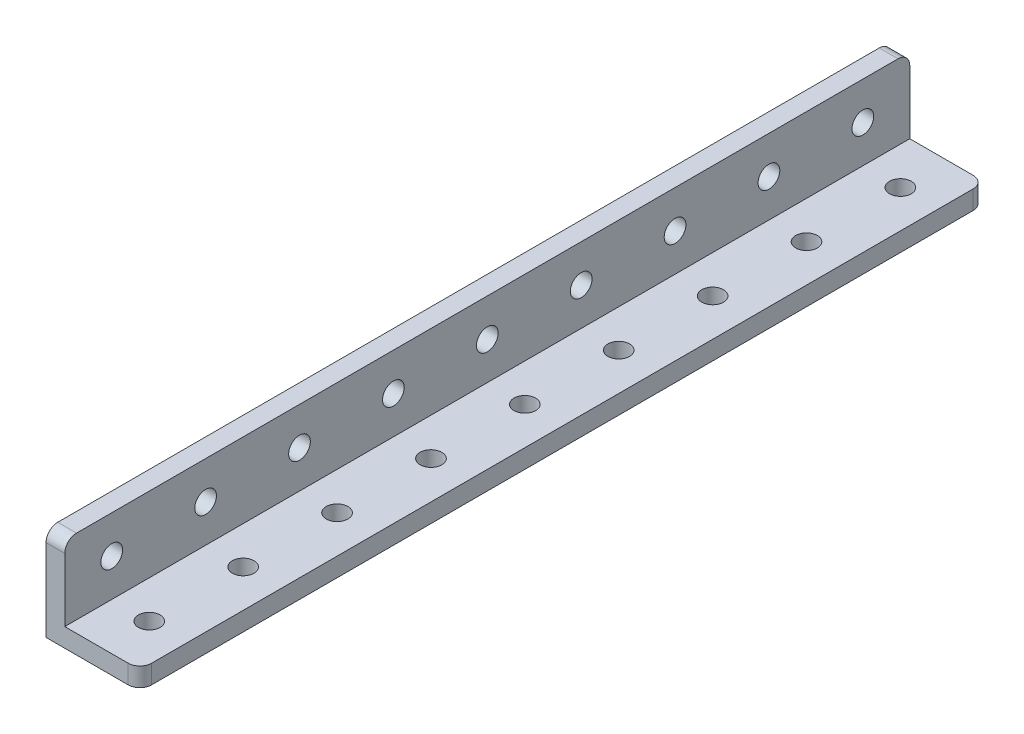
ISO-10303-21;
HEADER;
FILE_DESCRIPTION(('STEP AP214'),'2;1');
FILE_NAME('part.step','',(''),(''),'','','');
FILE_SCHEMA(('AUTOMOTIVE_DESIGN { 1 0 10303 214 1 1 1 1 }'));
ENDSEC;
DATA;
#1=APPLICATION_CONTEXT('core data for automotive mechanical design processes');
#2=APPLICATION_PROTOCOL_DEFINITION('international standard','automotive_design',2000,#1);
#3=PRODUCT_CONTEXT('',#1,'mechanical');
#4=PRODUCT('Part','Part','',(#3));
#5=PRODUCT_RELATED_PRODUCT_CATEGORY('part','',(#4));
#6=PRODUCT_DEFINITION_FORMATION('','',#4);
#7=PRODUCT_DEFINITION_CONTEXT('part definition',#1,'design');
#8=PRODUCT_DEFINITION('design','',#6,#7);
#9=PRODUCT_DEFINITION_SHAPE('','',#8);
#10=(LENGTH_UNIT() NAMED_UNIT(*) SI_UNIT(.MILLI.,.METRE.));
#11=(NAMED_UNIT(*) PLANE_ANGLE_UNIT() SI_UNIT($,.RADIAN.));
#12=(NAMED_UNIT(*) SI_UNIT($,.STERADIAN.) SOLID_ANGLE_UNIT());
#13=UNCERTAINTY_MEASURE_WITH_UNIT(LENGTH_MEASURE(1.E-05),#10,'distance_accuracy_value','');
#14=(GEOMETRIC_REPRESENTATION_CONTEXT(3) GLOBAL_UNCERTAINTY_ASSIGNED_CONTEXT((#13)) GLOBAL_UNIT_ASSIGNED_CONTEXT((#10,
#11,#12)) REPRESENTATION_CONTEXT('',''));
#15=CARTESIAN_POINT('',(0.,0.,0.));
#16=DIRECTION('',(0.,0.,1.));
#17=DIRECTION('',(1.,0.,0.));
#18=AXIS2_PLACEMENT_3D('',#15,#16,#17);
#19=CARTESIAN_POINT('',(0.,16.,-72.));
#20=DIRECTION('',(-1.,0.,0.));
#21=DIRECTION('',(0.,-1.,0.));
#22=AXIS2_PLACEMENT_3D('',#19,#20,#21);
#23=PLANE('',#22);
#24=CARTESIAN_POINT('',(0.,9.6,64.));
#25=DIRECTION('',(-1.,0.,0.));
#26=DIRECTION('',(0.,-1.,0.));
#27=AXIS2_PLACEMENT_3D('',#24,#25,#26);
#28=CIRCLE('',#27,1.85);
#29=CARTESIAN_POINT('',(0.,7.75,64.));
#30=VERTEX_POINT('',#29);
#31=EDGE_CURVE('E231',#30,#30,#28,.T.);
#32=ORIENTED_EDGE('',*,*,#31,.F.);
#33=EDGE_LOOP('',(#32));
#34=FACE_BOUND('',#33,.T.);
#35=CARTESIAN_POINT('',(0.,9.6,48.));
#36=DIRECTION('',(-1.,0.,0.));
#37=DIRECTION('',(0.,-1.,0.));
#38=AXIS2_PLACEMENT_3D('',#35,#36,#37);
#39=CIRCLE('',#38,1.85);
#40=CARTESIAN_POINT('',(0.,7.75,48.));
#41=VERTEX_POINT('',#40);
#42=EDGE_CURVE('E221',#41,#41,#39,.T.);
#43=ORIENTED_EDGE('',*,*,#42,.F.);
#44=EDGE_LOOP('',(#43));
#45=FACE_BOUND('',#44,.T.);
#46=CARTESIAN_POINT('',(0.,9.6,32.));
#47=DIRECTION('',(-1.,0.,0.));
#48=DIRECTION('',(0.,-1.,0.));
#49=AXIS2_PLACEMENT_3D('',#46,#47,#48);
#50=CIRCLE('',#49,1.85);
#51=CARTESIAN_POINT('',(0.,7.75,32.));
#52=VERTEX_POINT('',#51);
#53=EDGE_CURVE('E218',#52,#52,#50,.T.);
#54=ORIENTED_EDGE('',*,*,#53,.F.);
#55=EDGE_LOOP('',(#54));
#56=FACE_BOUND('',#55,.T.);
#57=CARTESIAN_POINT('',(0.,9.6,16.));
#58=DIRECTION('',(-1.,0.,0.));
#59=DIRECTION('',(0.,-1.,0.));
#60=AXIS2_PLACEMENT_3D('',#57,#58,#59);
#61=CIRCLE('',#60,1.85);
#62=CARTESIAN_POINT('',(0.,7.75,16.));
#63=VERTEX_POINT('',#62);
#64=EDGE_CURVE('E215',#63,#63,#61,.T.);
#65=ORIENTED_EDGE('',*,*,#64,.F.);
#66=EDGE_LOOP('',(#65));
#67=FACE_BOUND('',#66,.T.);
#68=CARTESIAN_POINT('',(0.,9.6,-64.));
#69=DIRECTION('',(-1.,0.,0.));
#70=DIRECTION('',(0.,-1.,0.));
#71=AXIS2_PLACEMENT_3D('',#68,#69,#70);
#72=CIRCLE('',#71,1.85);
#73=CARTESIAN_POINT('',(0.,7.75,-64.));
#74=VERTEX_POINT('',#73);
#75=EDGE_CURVE('E211',#74,#74,#72,.T.);
#76=ORIENTED_EDGE('',*,*,#75,.F.);
#77=EDGE_LOOP('',(#76));
#78=FACE_BOUND('',#77,.T.);
#79=CARTESIAN_POINT('',(0.,9.6,-48.));
#80=DIRECTION('',(-1.,0.,0.));
#81=DIRECTION('',(0.,-1.,0.));
#82=AXIS2_PLACEMENT_3D('',#79,#80,#81);
#83=CIRCLE('',#82,1.85);
#84=CARTESIAN_POINT('',(0.,7.75,-48.));
#85=VERTEX_POINT('',#84);
#86=EDGE_CURVE('E207',#85,#85,#83,.T.);
#87=ORIENTED_EDGE('',*,*,#86,.F.);
#88=EDGE_LOOP('',(#87));
#89=FACE_BOUND('',#88,.T.);
#90=CARTESIAN_POINT('',(0.,9.6,-32.));
#91=DIRECTION('',(-1.,0.,0.));
#92=DIRECTION('',(0.,-1.,0.));
#93=AXIS2_PLACEMENT_3D('',#90,#91,#92);
#94=CIRCLE('',#93,1.85);
#95=CARTESIAN_POINT('',(0.,7.75,-32.));
#96=VERTEX_POINT('',#95);
#97=EDGE_CURVE('E203',#96,#96,#94,.T.);
#98=ORIENTED_EDGE('',*,*,#97,.F.);
#99=EDGE_LOOP('',(#98));
#100=FACE_BOUND('',#99,.T.);
#101=CARTESIAN_POINT('',(0.,9.6,-16.));
#102=DIRECTION('',(-1.,0.,0.));
#103=DIRECTION('',(0.,-1.,0.));
#104=AXIS2_PLACEMENT_3D('',#101,#102,#103);
#105=CIRCLE('',#104,1.85);
#106=CARTESIAN_POINT('',(0.,7.75,-16.));
#107=VERTEX_POINT('',#106);
#108=EDGE_CURVE('E199',#107,#107,#105,.T.);
#109=ORIENTED_EDGE('',*,*,#108,.F.);
#110=EDGE_LOOP('',(#109));
#111=FACE_BOUND('',#110,.T.);
#112=CARTESIAN_POINT('',(0.,9.6,0.));
#113=DIRECTION('',(-1.,0.,0.));
#114=DIRECTION('',(0.,-1.,0.));
#115=AXIS2_PLACEMENT_3D('',#112,#113,#114);
#116=CIRCLE('',#115,1.85);
#117=CARTESIAN_POINT('',(0.,7.75,0.));
#118=VERTEX_POINT('',#117);
#119=EDGE_CURVE('E194',#118,#118,#116,.T.);
#120=ORIENTED_EDGE('',*,*,#119,.F.);
#121=EDGE_LOOP('',(#120));
#122=FACE_BOUND('',#121,.T.);
#123=DIRECTION('',(0.,0.,1.));
#124=VECTOR('',#123,1.);
#125=CARTESIAN_POINT('',(0.,16.,-72.));
#126=LINE('',#125,#124);
#127=CARTESIAN_POINT('',(0.,16.,-70.));
#128=VERTEX_POINT('',#127);
#129=CARTESIAN_POINT('',(0.,16.,70.));
#130=VERTEX_POINT('',#129);
#131=EDGE_CURVE('E151',#128,#130,#126,.T.);
#132=ORIENTED_EDGE('',*,*,#131,.F.);
#133=CARTESIAN_POINT('',(0.,14.,-70.));
#134=DIRECTION('',(-1.,0.,0.));
#135=DIRECTION('',(0.,-1.,0.));
#136=AXIS2_PLACEMENT_3D('',#133,#134,#135);
#137=CIRCLE('',#136,2.);
#138=CARTESIAN_POINT('',(0.,14.,-72.));
#139=VERTEX_POINT('',#138);
#140=EDGE_CURVE('E118',#128,#139,#137,.T.);
#141=ORIENTED_EDGE('',*,*,#140,.T.);
#142=DIRECTION('',(0.,-1.,0.));
#143=VECTOR('',#142,1.);
#144=CARTESIAN_POINT('',(0.,16.,-72.));
#145=LINE('',#144,#143);
#146=CARTESIAN_POINT('',(0.,0.,-72.));
#147=VERTEX_POINT('',#146);
#148=EDGE_CURVE('E113',#139,#147,#145,.T.);
#149=ORIENTED_EDGE('',*,*,#148,.T.);
#150=DIRECTION('',(0.,0.,1.));
#151=VECTOR('',#150,1.);
#152=CARTESIAN_POINT('',(0.,0.,-72.));
#153=LINE('',#152,#151);
#154=CARTESIAN_POINT('',(0.,0.,72.));
#155=VERTEX_POINT('',#154);
#156=EDGE_CURVE('E117',#147,#155,#153,.T.);
#157=ORIENTED_EDGE('',*,*,#156,.T.);
#158=DIRECTION('',(0.,-1.,0.));
#159=VECTOR('',#158,1.);
#160=CARTESIAN_POINT('',(0.,16.,72.));
#161=LINE('',#160,#159);
#162=CARTESIAN_POINT('',(0.,14.,72.));
#163=VERTEX_POINT('',#162);
#164=EDGE_CURVE('E143',#163,#155,#161,.T.);
#165=ORIENTED_EDGE('',*,*,#164,.F.);
#166=CARTESIAN_POINT('',(0.,14.,70.));
#167=DIRECTION('',(-1.,0.,0.));
#168=DIRECTION('',(0.,-1.,0.));
#169=AXIS2_PLACEMENT_3D('',#166,#167,#168);
#170=CIRCLE('',#169,2.);
#171=EDGE_CURVE('E169',#163,#130,#170,.T.);
#172=ORIENTED_EDGE('',*,*,#171,.T.);
#173=EDGE_LOOP('',(#132,#141,#149,#157,#165,#172));
#174=FACE_BOUND('',#173,.T.);
#175=ADVANCED_FACE('F32',(#34,#45,#56,#67,#78,#89,#100,#111,#122,#174),#23,.T.);
#176=CARTESIAN_POINT('',(3.2,16.,-72.));
#177=DIRECTION('',(0.,1.,0.));
#178=DIRECTION('',(0.,0.,1.));
#179=AXIS2_PLACEMENT_3D('',#176,#177,#178);
#180=PLANE('',#179);
#181=DIRECTION('',(0.,0.,1.));
#182=VECTOR('',#181,1.);
#183=CARTESIAN_POINT('',(3.2,16.,-72.));
#184=LINE('',#183,#182);
#185=CARTESIAN_POINT('',(3.2,16.,-70.));
#186=VERTEX_POINT('',#185);
#187=CARTESIAN_POINT('',(3.2,16.,70.));
#188=VERTEX_POINT('',#187);
#189=EDGE_CURVE('E155',#186,#188,#184,.T.);
#190=ORIENTED_EDGE('',*,*,#189,.F.);
#191=DIRECTION('',(-1.,0.,0.));
#192=VECTOR('',#191,1.);
#193=CARTESIAN_POINT('',(3.2,16.,-70.));
#194=LINE('',#193,#192);
#195=EDGE_CURVE('E166',#186,#128,#194,.T.);
#196=ORIENTED_EDGE('',*,*,#195,.T.);
#197=ORIENTED_EDGE('',*,*,#131,.T.);
#198=DIRECTION('',(-1.,0.,0.));
#199=VECTOR('',#198,1.);
#200=CARTESIAN_POINT('',(3.2,16.,70.));
#201=LINE('',#200,#199);
#202=EDGE_CURVE('E154',#130,#188,#201,.F.);
#203=ORIENTED_EDGE('',*,*,#202,.T.);
#204=EDGE_LOOP('',(#190,#196,#197,#203));
#205=FACE_BOUND('',#204,.T.);
#206=ADVANCED_FACE('F255',(#205),#180,.T.);
#207=CARTESIAN_POINT('',(3.2,3.2,-72.));
#208=DIRECTION('',(1.,0.,0.));
#209=DIRECTION('',(0.,0.,-1.));
#210=AXIS2_PLACEMENT_3D('',#207,#208,#209);
#211=PLANE('',#210);
#212=CARTESIAN_POINT('',(3.2,9.6,64.));
#213=DIRECTION('',(1.,0.,0.));
#214=DIRECTION('',(0.,0.,-1.));
#215=AXIS2_PLACEMENT_3D('',#212,#213,#214);
#216=CIRCLE('',#215,1.85);
#217=CARTESIAN_POINT('',(3.2,9.6,62.15));
#218=VERTEX_POINT('',#217);
#219=EDGE_CURVE('E36',#218,#218,#216,.T.);
#220=ORIENTED_EDGE('',*,*,#219,.F.);
#221=EDGE_LOOP('',(#220));
#222=FACE_BOUND('',#221,.T.);
#223=CARTESIAN_POINT('',(3.2,9.6,48.));
#224=DIRECTION('',(1.,0.,0.));
#225=DIRECTION('',(0.,0.,-1.));
#226=AXIS2_PLACEMENT_3D('',#223,#224,#225);
#227=CIRCLE('',#226,1.85);
#228=CARTESIAN_POINT('',(3.2,9.6,46.15));
#229=VERTEX_POINT('',#228);
#230=EDGE_CURVE('E219',#229,#229,#227,.T.);
#231=ORIENTED_EDGE('',*,*,#230,.F.);
#232=EDGE_LOOP('',(#231));
#233=FACE_BOUND('',#232,.T.);
#234=CARTESIAN_POINT('',(3.2,9.6,32.));
#235=DIRECTION('',(1.,0.,0.));
#236=DIRECTION('',(0.,0.,-1.));
#237=AXIS2_PLACEMENT_3D('',#234,#235,#236);
#238=CIRCLE('',#237,1.85);
#239=CARTESIAN_POINT('',(3.2,9.6,30.15));
#240=VERTEX_POINT('',#239);
#241=EDGE_CURVE('E216',#240,#240,#238,.T.);
#242=ORIENTED_EDGE('',*,*,#241,.F.);
#243=EDGE_LOOP('',(#242));
#244=FACE_BOUND('',#243,.T.);
#245=CARTESIAN_POINT('',(3.2,9.6,16.));
#246=DIRECTION('',(1.,0.,0.));
#247=DIRECTION('',(0.,0.,-1.));
#248=AXIS2_PLACEMENT_3D('',#245,#246,#247);
#249=CIRCLE('',#248,1.85);
#250=CARTESIAN_POINT('',(3.2,9.6,14.15));
#251=VERTEX_POINT('',#250);
#252=EDGE_CURVE('E212',#251,#251,#249,.T.);
#253=ORIENTED_EDGE('',*,*,#252,.F.);
#254=EDGE_LOOP('',(#253));
#255=FACE_BOUND('',#254,.T.);
#256=CARTESIAN_POINT('',(3.2,9.6,-64.));
#257=DIRECTION('',(1.,0.,0.));
#258=DIRECTION('',(0.,0.,-1.));
#259=AXIS2_PLACEMENT_3D('',#256,#257,#258);
#260=CIRCLE('',#259,1.85);
#261=CARTESIAN_POINT('',(3.2,9.6,-65.85));
#262=VERTEX_POINT('',#261);
#263=EDGE_CURVE('E208',#262,#262,#260,.T.);
#264=ORIENTED_EDGE('',*,*,#263,.F.);
#265=EDGE_LOOP('',(#264));
#266=FACE_BOUND('',#265,.T.);
#267=CARTESIAN_POINT('',(3.2,9.6,-48.));
#268=DIRECTION('',(1.,0.,0.));
#269=DIRECTION('',(0.,0.,-1.));
#270=AXIS2_PLACEMENT_3D('',#267,#268,#269);
#271=CIRCLE('',#270,1.85);
#272=CARTESIAN_POINT('',(3.2,9.6,-49.85));
#273=VERTEX_POINT('',#272);
#274=EDGE_CURVE('E204',#273,#273,#271,.T.);
#275=ORIENTED_EDGE('',*,*,#274,.F.);
#276=EDGE_LOOP('',(#275));
#277=FACE_BOUND('',#276,.T.);
#278=CARTESIAN_POINT('',(3.2,9.6,-32.));
#279=DIRECTION('',(1.,0.,0.));
#280=DIRECTION('',(0.,0.,-1.));
#281=AXIS2_PLACEMENT_3D('',#278,#279,#280);
#282=CIRCLE('',#281,1.85);
#283=CARTESIAN_POINT('',(3.2,9.6,-33.85));
#284=VERTEX_POINT('',#283);
#285=EDGE_CURVE('E200',#284,#284,#282,.T.);
#286=ORIENTED_EDGE('',*,*,#285,.F.);
#287=EDGE_LOOP('',(#286));
#288=FACE_BOUND('',#287,.T.);
#289=CARTESIAN_POINT('',(3.2,9.6,-16.));
#290=DIRECTION('',(1.,0.,0.));
#291=DIRECTION('',(0.,0.,-1.));
#292=AXIS2_PLACEMENT_3D('',#289,#290,#291);
#293=CIRCLE('',#292,1.85);
#294=CARTESIAN_POINT('',(3.2,9.6,-17.85));
#295=VERTEX_POINT('',#294);
#296=EDGE_CURVE('E195',#295,#295,#293,.T.);
#297=ORIENTED_EDGE('',*,*,#296,.F.);
#298=EDGE_LOOP('',(#297));
#299=FACE_BOUND('',#298,.T.);
#300=CARTESIAN_POINT('',(3.2,9.6,0.));
#301=DIRECTION('',(1.,0.,0.));
#302=DIRECTION('',(0.,0.,-1.));
#303=AXIS2_PLACEMENT_3D('',#300,#301,#302);
#304=CIRCLE('',#303,1.85);
#305=CARTESIAN_POINT('',(3.2,9.6,-1.85));
#306=VERTEX_POINT('',#305);
#307=EDGE_CURVE('E145',#306,#306,#304,.T.);
#308=ORIENTED_EDGE('',*,*,#307,.F.);
#309=EDGE_LOOP('',(#308));
#310=FACE_BOUND('',#309,.T.);
#311=DIRECTION('',(0.,1.,0.));
#312=VECTOR('',#311,1.);
#313=CARTESIAN_POINT('',(3.2,3.2,-72.));
#314=LINE('',#313,#312);
#315=CARTESIAN_POINT('',(3.2,3.2,-72.));
#316=VERTEX_POINT('',#315);
#317=CARTESIAN_POINT('',(3.2,14.,-72.));
#318=VERTEX_POINT('',#317);
#319=EDGE_CURVE('E130',#316,#318,#314,.T.);
#320=ORIENTED_EDGE('',*,*,#319,.T.);
#321=CARTESIAN_POINT('',(3.2,14.,-70.));
#322=DIRECTION('',(1.,0.,0.));
#323=DIRECTION('',(0.,0.,-1.));
#324=AXIS2_PLACEMENT_3D('',#321,#322,#323);
#325=CIRCLE('',#324,2.);
#326=EDGE_CURVE('E177',#318,#186,#325,.T.);
#327=ORIENTED_EDGE('',*,*,#326,.T.);
#328=ORIENTED_EDGE('',*,*,#189,.T.);
#329=CARTESIAN_POINT('',(3.2,14.,70.));
#330=DIRECTION('',(1.,0.,0.));
#331=DIRECTION('',(0.,0.,-1.));
#332=AXIS2_PLACEMENT_3D('',#329,#330,#331);
#333=CIRCLE('',#332,2.);
#334=CARTESIAN_POINT('',(3.2,14.,72.));
#335=VERTEX_POINT('',#334);
#336=EDGE_CURVE('E175',#188,#335,#333,.T.);
#337=ORIENTED_EDGE('',*,*,#336,.T.);
#338=DIRECTION('',(0.,1.,0.));
#339=VECTOR('',#338,1.);
#340=CARTESIAN_POINT('',(3.2,3.2,72.));
#341=LINE('',#340,#339);
#342=CARTESIAN_POINT('',(3.2,3.2,72.));
#343=VERTEX_POINT('',#342);
#344=EDGE_CURVE('E123',#343,#335,#341,.T.);
#345=ORIENTED_EDGE('',*,*,#344,.F.);
#346=DIRECTION('',(0.,0.,1.));
#347=VECTOR('',#346,1.);
#348=CARTESIAN_POINT('',(3.2,3.2,-72.));
#349=LINE('',#348,#347);
#350=EDGE_CURVE('E158',#316,#343,#349,.T.);
#351=ORIENTED_EDGE('',*,*,#350,.F.);
#352=EDGE_LOOP('',(#320,#327,#328,#337,#345,#351));
#353=FACE_BOUND('',#352,.T.);
#354=ADVANCED_FACE('F261',(#222,#233,#244,#255,#266,#277,#288,#299,#310,#353),#211,.T.);
#355=CARTESIAN_POINT('',(16.,3.2,-72.));
#356=DIRECTION('',(0.,1.,0.));
#357=DIRECTION('',(-1.,0.,0.));
#358=AXIS2_PLACEMENT_3D('',#355,#356,#357);
#359=PLANE('',#358);
#360=CARTESIAN_POINT('',(9.6,3.2,64.));
#361=DIRECTION('',(0.,1.,0.));
#362=DIRECTION('',(-1.,0.,0.));
#363=AXIS2_PLACEMENT_3D('',#360,#361,#362);
#364=CIRCLE('',#363,1.85);
#365=CARTESIAN_POINT('',(7.75,3.2,64.));
#366=VERTEX_POINT('',#365);
#367=EDGE_CURVE('E392',#366,#366,#364,.T.);
#368=ORIENTED_EDGE('',*,*,#367,.F.);
#369=EDGE_LOOP('',(#368));
#370=FACE_BOUND('',#369,.T.);
#371=CARTESIAN_POINT('',(9.6,3.2,48.));
#372=DIRECTION('',(0.,1.,0.));
#373=DIRECTION('',(-1.,0.,0.));
#374=AXIS2_PLACEMENT_3D('',#371,#372,#373);
#375=CIRCLE('',#374,1.85);
#376=CARTESIAN_POINT('',(7.75,3.2,48.));
#377=VERTEX_POINT('',#376);
#378=EDGE_CURVE('E402',#377,#377,#375,.T.);
#379=ORIENTED_EDGE('',*,*,#378,.F.);
#380=EDGE_LOOP('',(#379));
#381=FACE_BOUND('',#380,.T.);
#382=CARTESIAN_POINT('',(9.6,3.2,32.));
#383=DIRECTION('',(0.,1.,0.));
#384=DIRECTION('',(-1.,0.,0.));
#385=AXIS2_PLACEMENT_3D('',#382,#383,#384);
#386=CIRCLE('',#385,1.85);
#387=CARTESIAN_POINT('',(7.75,3.2,32.));
#388=VERTEX_POINT('',#387);
#389=EDGE_CURVE('E408',#388,#388,#386,.T.);
#390=ORIENTED_EDGE('',*,*,#389,.F.);
#391=EDGE_LOOP('',(#390));
#392=FACE_BOUND('',#391,.T.);
#393=CARTESIAN_POINT('',(9.6,3.2,16.));
#394=DIRECTION('',(0.,1.,0.));
#395=DIRECTION('',(-1.,0.,0.));
#396=AXIS2_PLACEMENT_3D('',#393,#394,#395);
#397=CIRCLE('',#396,1.85);
#398=CARTESIAN_POINT('',(7.75,3.2,16.));
#399=VERTEX_POINT('',#398);
#400=EDGE_CURVE('E414',#399,#399,#397,.T.);
#401=ORIENTED_EDGE('',*,*,#400,.F.);
#402=EDGE_LOOP('',(#401));
#403=FACE_BOUND('',#402,.T.);
#404=CARTESIAN_POINT('',(9.6,3.2,-64.));
#405=DIRECTION('',(0.,1.,0.));
#406=DIRECTION('',(-1.,0.,0.));
#407=AXIS2_PLACEMENT_3D('',#404,#405,#406);
#408=CIRCLE('',#407,1.85);
#409=CARTESIAN_POINT('',(7.75,3.2,-64.));
#410=VERTEX_POINT('',#409);
#411=EDGE_CURVE('E420',#410,#410,#408,.T.);
#412=ORIENTED_EDGE('',*,*,#411,.F.);
#413=EDGE_LOOP('',(#412));
#414=FACE_BOUND('',#413,.T.);
#415=CARTESIAN_POINT('',(9.6,3.2,-48.));
#416=DIRECTION('',(0.,1.,0.));
#417=DIRECTION('',(-1.,0.,0.));
#418=AXIS2_PLACEMENT_3D('',#415,#416,#417);
#419=CIRCLE('',#418,1.85);
#420=CARTESIAN_POINT('',(7.75,3.2,-48.));
#421=VERTEX_POINT('',#420);
#422=EDGE_CURVE('E426',#421,#421,#419,.T.);
#423=ORIENTED_EDGE('',*,*,#422,.F.);
#424=EDGE_LOOP('',(#423));
#425=FACE_BOUND('',#424,.T.);
#426=CARTESIAN_POINT('',(9.6,3.2,-32.));
#427=DIRECTION('',(0.,1.,0.));
#428=DIRECTION('',(-1.,0.,0.));
#429=AXIS2_PLACEMENT_3D('',#426,#427,#428);
#430=CIRCLE('',#429,1.85);
#431=CARTESIAN_POINT('',(7.75,3.2,-32.));
#432=VERTEX_POINT('',#431);
#433=EDGE_CURVE('E432',#432,#432,#430,.T.);
#434=ORIENTED_EDGE('',*,*,#433,.F.);
#435=EDGE_LOOP('',(#434));
#436=FACE_BOUND('',#435,.T.);
#437=CARTESIAN_POINT('',(9.6,3.2,-16.));
#438=DIRECTION('',(0.,1.,0.));
#439=DIRECTION('',(-1.,0.,0.));
#440=AXIS2_PLACEMENT_3D('',#437,#438,#439);
#441=CIRCLE('',#440,1.85);
#442=CARTESIAN_POINT('',(7.75,3.2,-16.));
#443=VERTEX_POINT('',#442);
#444=EDGE_CURVE('E437',#443,#443,#441,.T.);
#445=ORIENTED_EDGE('',*,*,#444,.F.);
#446=EDGE_LOOP('',(#445));
#447=FACE_BOUND('',#446,.T.);
#448=CARTESIAN_POINT('',(9.6,3.2,0.));
#449=DIRECTION('',(0.,1.,0.));
#450=DIRECTION('',(-1.,0.,0.));
#451=AXIS2_PLACEMENT_3D('',#448,#449,#450);
#452=CIRCLE('',#451,1.85);
#453=CARTESIAN_POINT('',(7.75,3.2,0.));
#454=VERTEX_POINT('',#453);
#455=EDGE_CURVE('E247',#454,#454,#452,.T.);
#456=ORIENTED_EDGE('',*,*,#455,.F.);
#457=EDGE_LOOP('',(#456));
#458=FACE_BOUND('',#457,.T.);
#459=DIRECTION('',(0.,0.,1.));
#460=VECTOR('',#459,1.);
#461=CARTESIAN_POINT('',(16.,3.2,-72.));
#462=LINE('',#461,#460);
#463=CARTESIAN_POINT('',(16.,3.2,-70.));
#464=VERTEX_POINT('',#463);
#465=CARTESIAN_POINT('',(16.,3.2,70.));
#466=VERTEX_POINT('',#465);
#467=EDGE_CURVE('E161',#464,#466,#462,.T.);
#468=ORIENTED_EDGE('',*,*,#467,.F.);
#469=CARTESIAN_POINT('',(14.,3.2,-70.));
#470=DIRECTION('',(0.,1.,0.));
#471=DIRECTION('',(-1.,0.,0.));
#472=AXIS2_PLACEMENT_3D('',#469,#470,#471);
#473=CIRCLE('',#472,2.);
#474=CARTESIAN_POINT('',(14.,3.2,-72.));
#475=VERTEX_POINT('',#474);
#476=EDGE_CURVE('E185',#464,#475,#473,.T.);
#477=ORIENTED_EDGE('',*,*,#476,.T.);
#478=DIRECTION('',(-1.,0.,0.));
#479=VECTOR('',#478,1.);
#480=CARTESIAN_POINT('',(16.,3.2,-72.));
#481=LINE('',#480,#479);
#482=EDGE_CURVE('E136',#475,#316,#481,.T.);
#483=ORIENTED_EDGE('',*,*,#482,.T.);
#484=ORIENTED_EDGE('',*,*,#350,.T.);
#485=DIRECTION('',(-1.,0.,0.));
#486=VECTOR('',#485,1.);
#487=CARTESIAN_POINT('',(16.,3.2,72.));
#488=LINE('',#487,#486);
#489=CARTESIAN_POINT('',(14.,3.2,72.));
#490=VERTEX_POINT('',#489);
#491=EDGE_CURVE('E147',#490,#343,#488,.T.);
#492=ORIENTED_EDGE('',*,*,#491,.F.);
#493=CARTESIAN_POINT('',(14.,3.2,70.));
#494=DIRECTION('',(0.,1.,0.));
#495=DIRECTION('',(-1.,0.,0.));
#496=AXIS2_PLACEMENT_3D('',#493,#494,#495);
#497=CIRCLE('',#496,2.);
#498=EDGE_CURVE('E57',#490,#466,#497,.T.);
#499=ORIENTED_EDGE('',*,*,#498,.T.);
#500=EDGE_LOOP('',(#468,#477,#483,#484,#492,#499));
#501=FACE_BOUND('',#500,.T.);
#502=ADVANCED_FACE('F287',(#370,#381,#392,#403,#414,#425,#436,#447,#458,#501),#359,.T.);
#503=CARTESIAN_POINT('',(16.,0.,-72.));
#504=DIRECTION('',(1.,0.,0.));
#505=DIRECTION('',(0.,0.,-1.));
#506=AXIS2_PLACEMENT_3D('',#503,#504,#505);
#507=PLANE('',#506);
#508=DIRECTION('',(0.,0.,1.));
#509=VECTOR('',#508,1.);
#510=CARTESIAN_POINT('',(16.,0.,-72.));
#511=LINE('',#510,#509);
#512=CARTESIAN_POINT('',(16.,0.,-70.));
#513=VERTEX_POINT('',#512);
#514=CARTESIAN_POINT('',(16.,0.,70.));
#515=VERTEX_POINT('',#514);
#516=EDGE_CURVE('E129',#513,#515,#511,.T.);
#517=ORIENTED_EDGE('',*,*,#516,.F.);
#518=DIRECTION('',(0.,1.,0.));
#519=VECTOR('',#518,1.);
#520=CARTESIAN_POINT('',(16.,0.,-70.));
#521=LINE('',#520,#519);
#522=EDGE_CURVE('E181',#513,#464,#521,.T.);
#523=ORIENTED_EDGE('',*,*,#522,.T.);
#524=ORIENTED_EDGE('',*,*,#467,.T.);
#525=DIRECTION('',(0.,1.,0.));
#526=VECTOR('',#525,1.);
#527=CARTESIAN_POINT('',(16.,0.,70.));
#528=LINE('',#527,#526);
#529=EDGE_CURVE('E179',#466,#515,#528,.F.);
#530=ORIENTED_EDGE('',*,*,#529,.T.);
#531=EDGE_LOOP('',(#517,#523,#524,#530));
#532=FACE_BOUND('',#531,.T.);
#533=ADVANCED_FACE('F301',(#532),#507,.T.);
#534=CARTESIAN_POINT('',(0.,0.,-72.));
#535=DIRECTION('',(0.,-1.,0.));
#536=DIRECTION('',(0.,0.,-1.));
#537=AXIS2_PLACEMENT_3D('',#534,#535,#536);
#538=PLANE('',#537);
#539=CARTESIAN_POINT('',(9.6,0.,64.));
#540=DIRECTION('',(0.,-1.,0.));
#541=DIRECTION('',(0.,0.,-1.));
#542=AXIS2_PLACEMENT_3D('',#539,#540,#541);
#543=CIRCLE('',#542,1.85);
#544=CARTESIAN_POINT('',(9.6,0.,62.15));
#545=VERTEX_POINT('',#544);
#546=EDGE_CURVE('E395',#545,#545,#543,.T.);
#547=ORIENTED_EDGE('',*,*,#546,.F.);
#548=EDGE_LOOP('',(#547));
#549=FACE_BOUND('',#548,.T.);
#550=CARTESIAN_POINT('',(9.6,0.,48.));
#551=DIRECTION('',(0.,-1.,0.));
#552=DIRECTION('',(0.,0.,-1.));
#553=AXIS2_PLACEMENT_3D('',#550,#551,#552);
#554=CIRCLE('',#553,1.85);
#555=CARTESIAN_POINT('',(9.6,0.,46.15));
#556=VERTEX_POINT('',#555);
#557=EDGE_CURVE('E397',#556,#556,#554,.T.);
#558=ORIENTED_EDGE('',*,*,#557,.F.);
#559=EDGE_LOOP('',(#558));
#560=FACE_BOUND('',#559,.T.);
#561=CARTESIAN_POINT('',(9.6,0.,32.));
#562=DIRECTION('',(0.,-1.,0.));
#563=DIRECTION('',(0.,0.,-1.));
#564=AXIS2_PLACEMENT_3D('',#561,#562,#563);
#565=CIRCLE('',#564,1.85);
#566=CARTESIAN_POINT('',(9.6,0.,30.15));
#567=VERTEX_POINT('',#566);
#568=EDGE_CURVE('E405',#567,#567,#565,.T.);
#569=ORIENTED_EDGE('',*,*,#568,.F.);
#570=EDGE_LOOP('',(#569));
#571=FACE_BOUND('',#570,.T.);
#572=CARTESIAN_POINT('',(9.6,0.,16.));
#573=DIRECTION('',(0.,-1.,0.));
#574=DIRECTION('',(0.,0.,-1.));
#575=AXIS2_PLACEMENT_3D('',#572,#573,#574);
#576=CIRCLE('',#575,1.85);
#577=CARTESIAN_POINT('',(9.6,0.,14.15));
#578=VERTEX_POINT('',#577);
#579=EDGE_CURVE('E411',#578,#578,#576,.T.);
#580=ORIENTED_EDGE('',*,*,#579,.F.);
#581=EDGE_LOOP('',(#580));
#582=FACE_BOUND('',#581,.T.);
#583=CARTESIAN_POINT('',(9.6,0.,-64.));
#584=DIRECTION('',(0.,-1.,0.));
#585=DIRECTION('',(0.,0.,-1.));
#586=AXIS2_PLACEMENT_3D('',#583,#584,#585);
#587=CIRCLE('',#586,1.85);
#588=CARTESIAN_POINT('',(9.6,0.,-65.85));
#589=VERTEX_POINT('',#588);
#590=EDGE_CURVE('E417',#589,#589,#587,.T.);
#591=ORIENTED_EDGE('',*,*,#590,.F.);
#592=EDGE_LOOP('',(#591));
#593=FACE_BOUND('',#592,.T.);
#594=CARTESIAN_POINT('',(9.6,0.,-48.));
#595=DIRECTION('',(0.,-1.,0.));
#596=DIRECTION('',(0.,0.,-1.));
#597=AXIS2_PLACEMENT_3D('',#594,#595,#596);
#598=CIRCLE('',#597,1.85);
#599=CARTESIAN_POINT('',(9.6,0.,-49.85));
#600=VERTEX_POINT('',#599);
#601=EDGE_CURVE('E423',#600,#600,#598,.T.);
#602=ORIENTED_EDGE('',*,*,#601,.F.);
#603=EDGE_LOOP('',(#602));
#604=FACE_BOUND('',#603,.T.);
#605=CARTESIAN_POINT('',(9.6,0.,-32.));
#606=DIRECTION('',(0.,-1.,0.));
#607=DIRECTION('',(0.,0.,-1.));
#608=AXIS2_PLACEMENT_3D('',#605,#606,#607);
#609=CIRCLE('',#608,1.85);
#610=CARTESIAN_POINT('',(9.6,0.,-33.85));
#611=VERTEX_POINT('',#610);
#612=EDGE_CURVE('E429',#611,#611,#609,.T.);
#613=ORIENTED_EDGE('',*,*,#612,.F.);
#614=EDGE_LOOP('',(#613));
#615=FACE_BOUND('',#614,.T.);
#616=CARTESIAN_POINT('',(9.6,0.,-16.));
#617=DIRECTION('',(0.,-1.,0.));
#618=DIRECTION('',(0.,0.,-1.));
#619=AXIS2_PLACEMENT_3D('',#616,#617,#618);
#620=CIRCLE('',#619,1.85);
#621=CARTESIAN_POINT('',(9.6,0.,-17.85));
#622=VERTEX_POINT('',#621);
#623=EDGE_CURVE('E435',#622,#622,#620,.T.);
#624=ORIENTED_EDGE('',*,*,#623,.F.);
#625=EDGE_LOOP('',(#624));
#626=FACE_BOUND('',#625,.T.);
#627=CARTESIAN_POINT('',(9.6,0.,0.));
#628=DIRECTION('',(0.,-1.,0.));
#629=DIRECTION('',(0.,0.,-1.));
#630=AXIS2_PLACEMENT_3D('',#627,#628,#629);
#631=CIRCLE('',#630,1.85);
#632=CARTESIAN_POINT('',(9.6,0.,-1.85));
#633=VERTEX_POINT('',#632);
#634=EDGE_CURVE('E198',#633,#633,#631,.T.);
#635=ORIENTED_EDGE('',*,*,#634,.F.);
#636=EDGE_LOOP('',(#635));
#637=FACE_BOUND('',#636,.T.);
#638=DIRECTION('',(1.,0.,0.));
#639=VECTOR('',#638,1.);
#640=CARTESIAN_POINT('',(0.,0.,-72.));
#641=LINE('',#640,#639);
#642=CARTESIAN_POINT('',(14.,0.,-72.));
#643=VERTEX_POINT('',#642);
#644=EDGE_CURVE('E122',#147,#643,#641,.T.);
#645=ORIENTED_EDGE('',*,*,#644,.T.);
#646=CARTESIAN_POINT('',(14.,0.,-70.));
#647=DIRECTION('',(0.,-1.,0.));
#648=DIRECTION('',(0.,0.,-1.));
#649=AXIS2_PLACEMENT_3D('',#646,#647,#648);
#650=CIRCLE('',#649,2.);
#651=EDGE_CURVE('E188',#643,#513,#650,.T.);
#652=ORIENTED_EDGE('',*,*,#651,.T.);
#653=ORIENTED_EDGE('',*,*,#516,.T.);
#654=CARTESIAN_POINT('',(14.,0.,70.));
#655=DIRECTION('',(0.,-1.,0.));
#656=DIRECTION('',(0.,0.,-1.));
#657=AXIS2_PLACEMENT_3D('',#654,#655,#656);
#658=CIRCLE('',#657,2.);
#659=CARTESIAN_POINT('',(14.,0.,72.));
#660=VERTEX_POINT('',#659);
#661=EDGE_CURVE('E49',#515,#660,#658,.T.);
#662=ORIENTED_EDGE('',*,*,#661,.T.);
#663=DIRECTION('',(1.,0.,0.));
#664=VECTOR('',#663,1.);
#665=CARTESIAN_POINT('',(0.,0.,72.));
#666=LINE('',#665,#664);
#667=EDGE_CURVE('E128',#155,#660,#666,.T.);
#668=ORIENTED_EDGE('',*,*,#667,.F.);
#669=ORIENTED_EDGE('',*,*,#156,.F.);
#670=EDGE_LOOP('',(#645,#652,#653,#662,#668,#669));
#671=FACE_BOUND('',#670,.T.);
#672=ADVANCED_FACE('F126',(#549,#560,#571,#582,#593,#604,#615,#626,#637,#671),#538,.T.);
#673=CARTESIAN_POINT('',(0.,16.,-72.));
#674=DIRECTION('',(0.,0.,-1.));
#675=DIRECTION('',(-1.,0.,0.));
#676=AXIS2_PLACEMENT_3D('',#673,#674,#675);
#677=PLANE('',#676);
#678=ORIENTED_EDGE('',*,*,#148,.F.);
#679=DIRECTION('',(-1.,0.,0.));
#680=VECTOR('',#679,1.);
#681=CARTESIAN_POINT('',(0.,14.,-72.));
#682=LINE('',#681,#680);
#683=EDGE_CURVE('E173',#139,#318,#682,.F.);
#684=ORIENTED_EDGE('',*,*,#683,.T.);
#685=ORIENTED_EDGE('',*,*,#319,.F.);
#686=ORIENTED_EDGE('',*,*,#482,.F.);
#687=DIRECTION('',(0.,1.,0.));
#688=VECTOR('',#687,1.);
#689=CARTESIAN_POINT('',(14.,16.,-72.));
#690=LINE('',#689,#688);
#691=EDGE_CURVE('E135',#475,#643,#690,.F.);
#692=ORIENTED_EDGE('',*,*,#691,.T.);
#693=ORIENTED_EDGE('',*,*,#644,.F.);
#694=EDGE_LOOP('',(#678,#684,#685,#686,#692,#693));
#695=FACE_BOUND('',#694,.T.);
#696=ADVANCED_FACE('F132',(#695),#677,.T.);
#697=CARTESIAN_POINT('',(0.,16.,72.));
#698=DIRECTION('',(0.,0.,-1.));
#699=DIRECTION('',(-1.,0.,0.));
#700=AXIS2_PLACEMENT_3D('',#697,#698,#699);
#701=PLANE('',#700);
#702=ORIENTED_EDGE('',*,*,#667,.T.);
#703=DIRECTION('',(0.,1.,0.));
#704=VECTOR('',#703,1.);
#705=CARTESIAN_POINT('',(14.,3.2,72.));
#706=LINE('',#705,#704);
#707=EDGE_CURVE('E11',#660,#490,#706,.T.);
#708=ORIENTED_EDGE('',*,*,#707,.T.);
#709=ORIENTED_EDGE('',*,*,#491,.T.);
#710=ORIENTED_EDGE('',*,*,#344,.T.);
#711=DIRECTION('',(-1.,0.,0.));
#712=VECTOR('',#711,1.);
#713=CARTESIAN_POINT('',(0.,14.,72.));
#714=LINE('',#713,#712);
#715=EDGE_CURVE('E41',#335,#163,#714,.T.);
#716=ORIENTED_EDGE('',*,*,#715,.T.);
#717=ORIENTED_EDGE('',*,*,#164,.T.);
#718=EDGE_LOOP('',(#702,#708,#709,#710,#716,#717));
#719=FACE_BOUND('',#718,.T.);
#720=ADVANCED_FACE('F273',(#719),#701,.F.);
#721=CARTESIAN_POINT('',(3.2,14.,-70.));
#722=DIRECTION('',(-1.,0.,0.));
#723=DIRECTION('',(0.,0.,1.));
#724=AXIS2_PLACEMENT_3D('',#721,#722,#723);
#725=CYLINDRICAL_SURFACE('',#724,2.);
#726=ORIENTED_EDGE('',*,*,#326,.F.);
#727=ORIENTED_EDGE('',*,*,#683,.F.);
#728=ORIENTED_EDGE('',*,*,#140,.F.);
#729=ORIENTED_EDGE('',*,*,#195,.F.);
#730=EDGE_LOOP('',(#726,#727,#728,#729));
#731=FACE_BOUND('',#730,.T.);
#732=ADVANCED_FACE('F269',(#731),#725,.T.);
#733=CARTESIAN_POINT('',(14.,0.,-70.));
#734=DIRECTION('',(0.,1.,0.));
#735=DIRECTION('',(0.,0.,1.));
#736=AXIS2_PLACEMENT_3D('',#733,#734,#735);
#737=CYLINDRICAL_SURFACE('',#736,2.);
#738=ORIENTED_EDGE('',*,*,#651,.F.);
#739=ORIENTED_EDGE('',*,*,#691,.F.);
#740=ORIENTED_EDGE('',*,*,#476,.F.);
#741=ORIENTED_EDGE('',*,*,#522,.F.);
#742=EDGE_LOOP('',(#738,#739,#740,#741));
#743=FACE_BOUND('',#742,.T.);
#744=ADVANCED_FACE('F272',(#743),#737,.T.);
#745=CARTESIAN_POINT('',(14.,16.,70.));
#746=DIRECTION('',(0.,-1.,0.));
#747=DIRECTION('',(0.,0.,-1.));
#748=AXIS2_PLACEMENT_3D('',#745,#746,#747);
#749=CYLINDRICAL_SURFACE('',#748,2.);
#750=ORIENTED_EDGE('',*,*,#661,.F.);
#751=ORIENTED_EDGE('',*,*,#529,.F.);
#752=ORIENTED_EDGE('',*,*,#498,.F.);
#753=ORIENTED_EDGE('',*,*,#707,.F.);
#754=EDGE_LOOP('',(#750,#751,#752,#753));
#755=FACE_BOUND('',#754,.T.);
#756=ADVANCED_FACE('F276',(#755),#749,.T.);
#757=CARTESIAN_POINT('',(0.,14.,70.));
#758=DIRECTION('',(1.,0.,0.));
#759=DIRECTION('',(0.,0.,-1.));
#760=AXIS2_PLACEMENT_3D('',#757,#758,#759);
#761=CYLINDRICAL_SURFACE('',#760,2.);
#762=ORIENTED_EDGE('',*,*,#336,.F.);
#763=ORIENTED_EDGE('',*,*,#202,.F.);
#764=ORIENTED_EDGE('',*,*,#171,.F.);
#765=ORIENTED_EDGE('',*,*,#715,.F.);
#766=EDGE_LOOP('',(#762,#763,#764,#765));
#767=FACE_BOUND('',#766,.T.);
#768=ADVANCED_FACE('F34',(#767),#761,.T.);
#769=CARTESIAN_POINT('',(16.,9.6,0.));
#770=DIRECTION('',(-1.,0.,0.));
#771=DIRECTION('',(0.,-1.,0.));
#772=AXIS2_PLACEMENT_3D('',#769,#770,#771);
#773=CYLINDRICAL_SURFACE('',#772,1.85);
#774=ORIENTED_EDGE('',*,*,#307,.T.);
#775=EDGE_LOOP('',(#774));
#776=FACE_BOUND('',#775,.T.);
#777=ORIENTED_EDGE('',*,*,#119,.T.);
#778=EDGE_LOOP('',(#777));
#779=FACE_BOUND('',#778,.T.);
#780=ADVANCED_FACE('F252',(#776,#779),#773,.F.);
#781=CARTESIAN_POINT('',(9.6,16.,0.));
#782=DIRECTION('',(0.,-1.,0.));
#783=DIRECTION('',(0.,0.,-1.));
#784=AXIS2_PLACEMENT_3D('',#781,#782,#783);
#785=CYLINDRICAL_SURFACE('',#784,1.85);
#786=ORIENTED_EDGE('',*,*,#455,.T.);
#787=EDGE_LOOP('',(#786));
#788=FACE_BOUND('',#787,.T.);
#789=ORIENTED_EDGE('',*,*,#634,.T.);
#790=EDGE_LOOP('',(#789));
#791=FACE_BOUND('',#790,.T.);
#792=ADVANCED_FACE('F320',(#788,#791),#785,.F.);
#793=CARTESIAN_POINT('',(16.,9.6,-16.));
#794=DIRECTION('',(-1.,0.,0.));
#795=DIRECTION('',(0.,-1.,0.));
#796=AXIS2_PLACEMENT_3D('',#793,#794,#795);
#797=CYLINDRICAL_SURFACE('',#796,1.85);
#798=ORIENTED_EDGE('',*,*,#296,.T.);
#799=EDGE_LOOP('',(#798));
#800=FACE_BOUND('',#799,.T.);
#801=ORIENTED_EDGE('',*,*,#108,.T.);
#802=EDGE_LOOP('',(#801));
#803=FACE_BOUND('',#802,.T.);
#804=ADVANCED_FACE('F324',(#800,#803),#797,.F.);
#805=CARTESIAN_POINT('',(16.,9.6,-32.));
#806=DIRECTION('',(-1.,0.,0.));
#807=DIRECTION('',(0.,-1.,0.));
#808=AXIS2_PLACEMENT_3D('',#805,#806,#807);
#809=CYLINDRICAL_SURFACE('',#808,1.85);
#810=ORIENTED_EDGE('',*,*,#285,.T.);
#811=EDGE_LOOP('',(#810));
#812=FACE_BOUND('',#811,.T.);
#813=ORIENTED_EDGE('',*,*,#97,.T.);
#814=EDGE_LOOP('',(#813));
#815=FACE_BOUND('',#814,.T.);
#816=ADVANCED_FACE('F328',(#812,#815),#809,.F.);
#817=CARTESIAN_POINT('',(16.,9.6,-48.));
#818=DIRECTION('',(-1.,0.,0.));
#819=DIRECTION('',(0.,-1.,0.));
#820=AXIS2_PLACEMENT_3D('',#817,#818,#819);
#821=CYLINDRICAL_SURFACE('',#820,1.85);
#822=ORIENTED_EDGE('',*,*,#274,.T.);
#823=EDGE_LOOP('',(#822));
#824=FACE_BOUND('',#823,.T.);
#825=ORIENTED_EDGE('',*,*,#86,.T.);
#826=EDGE_LOOP('',(#825));
#827=FACE_BOUND('',#826,.T.);
#828=ADVANCED_FACE('F332',(#824,#827),#821,.F.);
#829=CARTESIAN_POINT('',(16.,9.6,-64.));
#830=DIRECTION('',(-1.,0.,0.));
#831=DIRECTION('',(0.,-1.,0.));
#832=AXIS2_PLACEMENT_3D('',#829,#830,#831);
#833=CYLINDRICAL_SURFACE('',#832,1.85);
#834=ORIENTED_EDGE('',*,*,#263,.T.);
#835=EDGE_LOOP('',(#834));
#836=FACE_BOUND('',#835,.T.);
#837=ORIENTED_EDGE('',*,*,#75,.T.);
#838=EDGE_LOOP('',(#837));
#839=FACE_BOUND('',#838,.T.);
#840=ADVANCED_FACE('F336',(#836,#839),#833,.F.);
#841=CARTESIAN_POINT('',(16.,9.6,16.));
#842=DIRECTION('',(-1.,0.,0.));
#843=DIRECTION('',(0.,-1.,0.));
#844=AXIS2_PLACEMENT_3D('',#841,#842,#843);
#845=CYLINDRICAL_SURFACE('',#844,1.85);
#846=ORIENTED_EDGE('',*,*,#252,.T.);
#847=EDGE_LOOP('',(#846));
#848=FACE_BOUND('',#847,.T.);
#849=ORIENTED_EDGE('',*,*,#64,.T.);
#850=EDGE_LOOP('',(#849));
#851=FACE_BOUND('',#850,.T.);
#852=ADVANCED_FACE('F340',(#848,#851),#845,.F.);
#853=CARTESIAN_POINT('',(16.,9.6,32.));
#854=DIRECTION('',(-1.,0.,0.));
#855=DIRECTION('',(0.,-1.,0.));
#856=AXIS2_PLACEMENT_3D('',#853,#854,#855);
#857=CYLINDRICAL_SURFACE('',#856,1.85);
#858=ORIENTED_EDGE('',*,*,#241,.T.);
#859=EDGE_LOOP('',(#858));
#860=FACE_BOUND('',#859,.T.);
#861=ORIENTED_EDGE('',*,*,#53,.T.);
#862=EDGE_LOOP('',(#861));
#863=FACE_BOUND('',#862,.T.);
#864=ADVANCED_FACE('F344',(#860,#863),#857,.F.);
#865=CARTESIAN_POINT('',(16.,9.6,48.));
#866=DIRECTION('',(-1.,0.,0.));
#867=DIRECTION('',(0.,-1.,0.));
#868=AXIS2_PLACEMENT_3D('',#865,#866,#867);
#869=CYLINDRICAL_SURFACE('',#868,1.85);
#870=ORIENTED_EDGE('',*,*,#230,.T.);
#871=EDGE_LOOP('',(#870));
#872=FACE_BOUND('',#871,.T.);
#873=ORIENTED_EDGE('',*,*,#42,.T.);
#874=EDGE_LOOP('',(#873));
#875=FACE_BOUND('',#874,.T.);
#876=ADVANCED_FACE('F348',(#872,#875),#869,.F.);
#877=CARTESIAN_POINT('',(16.,9.6,64.));
#878=DIRECTION('',(-1.,0.,0.));
#879=DIRECTION('',(0.,-1.,0.));
#880=AXIS2_PLACEMENT_3D('',#877,#878,#879);
#881=CYLINDRICAL_SURFACE('',#880,1.85);
#882=ORIENTED_EDGE('',*,*,#219,.T.);
#883=EDGE_LOOP('',(#882));
#884=FACE_BOUND('',#883,.T.);
#885=ORIENTED_EDGE('',*,*,#31,.T.);
#886=EDGE_LOOP('',(#885));
#887=FACE_BOUND('',#886,.T.);
#888=ADVANCED_FACE('F352',(#884,#887),#881,.F.);
#889=CARTESIAN_POINT('',(9.6,16.,-16.));
#890=DIRECTION('',(0.,-1.,0.));
#891=DIRECTION('',(0.,0.,-1.));
#892=AXIS2_PLACEMENT_3D('',#889,#890,#891);
#893=CYLINDRICAL_SURFACE('',#892,1.85);
#894=ORIENTED_EDGE('',*,*,#444,.T.);
#895=EDGE_LOOP('',(#894));
#896=FACE_BOUND('',#895,.T.);
#897=ORIENTED_EDGE('',*,*,#623,.T.);
#898=EDGE_LOOP('',(#897));
#899=FACE_BOUND('',#898,.T.);
#900=ADVANCED_FACE('F355',(#896,#899),#893,.F.);
#901=CARTESIAN_POINT('',(9.6,16.,-32.));
#902=DIRECTION('',(0.,-1.,0.));
#903=DIRECTION('',(0.,0.,-1.));
#904=AXIS2_PLACEMENT_3D('',#901,#902,#903);
#905=CYLINDRICAL_SURFACE('',#904,1.85);
#906=ORIENTED_EDGE('',*,*,#433,.T.);
#907=EDGE_LOOP('',(#906));
#908=FACE_BOUND('',#907,.T.);
#909=ORIENTED_EDGE('',*,*,#612,.T.);
#910=EDGE_LOOP('',(#909));
#911=FACE_BOUND('',#910,.T.);
#912=ADVANCED_FACE('F359',(#908,#911),#905,.F.);
#913=CARTESIAN_POINT('',(9.6,16.,-48.));
#914=DIRECTION('',(0.,-1.,0.));
#915=DIRECTION('',(0.,0.,-1.));
#916=AXIS2_PLACEMENT_3D('',#913,#914,#915);
#917=CYLINDRICAL_SURFACE('',#916,1.85);
#918=ORIENTED_EDGE('',*,*,#422,.T.);
#919=EDGE_LOOP('',(#918));
#920=FACE_BOUND('',#919,.T.);
#921=ORIENTED_EDGE('',*,*,#601,.T.);
#922=EDGE_LOOP('',(#921));
#923=FACE_BOUND('',#922,.T.);
#924=ADVANCED_FACE('F363',(#920,#923),#917,.F.);
#925=CARTESIAN_POINT('',(9.6,16.,-64.));
#926=DIRECTION('',(0.,-1.,0.));
#927=DIRECTION('',(0.,0.,-1.));
#928=AXIS2_PLACEMENT_3D('',#925,#926,#927);
#929=CYLINDRICAL_SURFACE('',#928,1.85);
#930=ORIENTED_EDGE('',*,*,#411,.T.);
#931=EDGE_LOOP('',(#930));
#932=FACE_BOUND('',#931,.T.);
#933=ORIENTED_EDGE('',*,*,#590,.T.);
#934=EDGE_LOOP('',(#933));
#935=FACE_BOUND('',#934,.T.);
#936=ADVANCED_FACE('F367',(#932,#935),#929,.F.);
#937=CARTESIAN_POINT('',(9.6,16.,16.));
#938=DIRECTION('',(0.,-1.,0.));
#939=DIRECTION('',(0.,0.,-1.));
#940=AXIS2_PLACEMENT_3D('',#937,#938,#939);
#941=CYLINDRICAL_SURFACE('',#940,1.85);
#942=ORIENTED_EDGE('',*,*,#400,.T.);
#943=EDGE_LOOP('',(#942));
#944=FACE_BOUND('',#943,.T.);
#945=ORIENTED_EDGE('',*,*,#579,.T.);
#946=EDGE_LOOP('',(#945));
#947=FACE_BOUND('',#946,.T.);
#948=ADVANCED_FACE('F371',(#944,#947),#941,.F.);
#949=CARTESIAN_POINT('',(9.6,16.,32.));
#950=DIRECTION('',(0.,-1.,0.));
#951=DIRECTION('',(0.,0.,-1.));
#952=AXIS2_PLACEMENT_3D('',#949,#950,#951);
#953=CYLINDRICAL_SURFACE('',#952,1.85);
#954=ORIENTED_EDGE('',*,*,#389,.T.);
#955=EDGE_LOOP('',(#954));
#956=FACE_BOUND('',#955,.T.);
#957=ORIENTED_EDGE('',*,*,#568,.T.);
#958=EDGE_LOOP('',(#957));
#959=FACE_BOUND('',#958,.T.);
#960=ADVANCED_FACE('F375',(#956,#959),#953,.F.);
#961=CARTESIAN_POINT('',(9.6,16.,48.));
#962=DIRECTION('',(0.,-1.,0.));
#963=DIRECTION('',(0.,0.,-1.));
#964=AXIS2_PLACEMENT_3D('',#961,#962,#963);
#965=CYLINDRICAL_SURFACE('',#964,1.85);
#966=ORIENTED_EDGE('',*,*,#378,.T.);
#967=EDGE_LOOP('',(#966));
#968=FACE_BOUND('',#967,.T.);
#969=ORIENTED_EDGE('',*,*,#557,.T.);
#970=EDGE_LOOP('',(#969));
#971=FACE_BOUND('',#970,.T.);
#972=ADVANCED_FACE('F379',(#968,#971),#965,.F.);
#973=CARTESIAN_POINT('',(9.6,16.,64.));
#974=DIRECTION('',(0.,-1.,0.));
#975=DIRECTION('',(0.,0.,-1.));
#976=AXIS2_PLACEMENT_3D('',#973,#974,#975);
#977=CYLINDRICAL_SURFACE('',#976,1.85);
#978=ORIENTED_EDGE('',*,*,#367,.T.);
#979=EDGE_LOOP('',(#978));
#980=FACE_BOUND('',#979,.T.);
#981=ORIENTED_EDGE('',*,*,#546,.T.);
#982=EDGE_LOOP('',(#981));
#983=FACE_BOUND('',#982,.T.);
#984=ADVANCED_FACE('F383',(#980,#983),#977,.F.);
#985=CLOSED_SHELL('',(#175,#206,#354,#502,#533,#672,#696,#720,#732,#744,#756,#768,#780,#792,
#804,#816,#828,#840,#852,#864,#876,#888,#900,#912,#924,#936,#948,#960,#972,#984));
#986=MANIFOLD_SOLID_BREP('B2',#985);
#987=ADVANCED_BREP_SHAPE_REPRESENTATION('',(#18,#986),#14);
#988=SHAPE_DEFINITION_REPRESENTATION(#9,#987);
ENDSEC;
END-ISO-10303-21;
